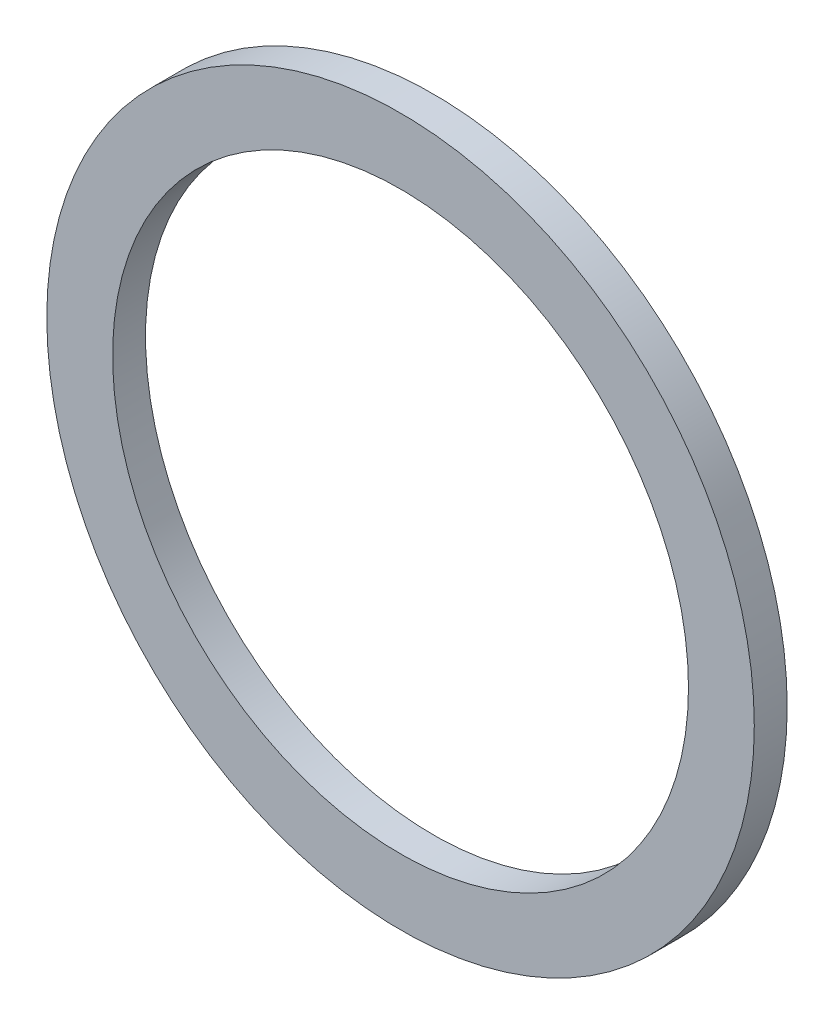
ISO-10303-21;
HEADER;
FILE_DESCRIPTION(('STEP AP214'),'2;1');
FILE_NAME('part.step','',(''),(''),'','','');
FILE_SCHEMA(('AUTOMOTIVE_DESIGN { 1 0 10303 214 1 1 1 1 }'));
ENDSEC;
DATA;
#1=APPLICATION_CONTEXT('core data for automotive mechanical design processes');
#2=APPLICATION_PROTOCOL_DEFINITION('international standard','automotive_design',2000,#1);
#3=PRODUCT_CONTEXT('',#1,'mechanical');
#4=PRODUCT('Part','Part','',(#3));
#5=PRODUCT_RELATED_PRODUCT_CATEGORY('part','',(#4));
#6=PRODUCT_DEFINITION_FORMATION('','',#4);
#7=PRODUCT_DEFINITION_CONTEXT('part definition',#1,'design');
#8=PRODUCT_DEFINITION('design','',#6,#7);
#9=PRODUCT_DEFINITION_SHAPE('','',#8);
#10=(LENGTH_UNIT() NAMED_UNIT(*) SI_UNIT(.MILLI.,.METRE.));
#11=(NAMED_UNIT(*) PLANE_ANGLE_UNIT() SI_UNIT($,.RADIAN.));
#12=(NAMED_UNIT(*) SI_UNIT($,.STERADIAN.) SOLID_ANGLE_UNIT());
#13=UNCERTAINTY_MEASURE_WITH_UNIT(LENGTH_MEASURE(1.E-05),#10,'distance_accuracy_value','');
#14=(GEOMETRIC_REPRESENTATION_CONTEXT(3) GLOBAL_UNCERTAINTY_ASSIGNED_CONTEXT((#13)) GLOBAL_UNIT_ASSIGNED_CONTEXT((#10,
#11,#12)) REPRESENTATION_CONTEXT('',''));
#15=CARTESIAN_POINT('',(0.,0.,0.));
#16=DIRECTION('',(0.,0.,1.));
#17=DIRECTION('',(1.,0.,0.));
#18=AXIS2_PLACEMENT_3D('',#15,#16,#17);
#19=CARTESIAN_POINT('',(0.,0.,-2.));
#20=DIRECTION('',(0.,0.,1.));
#21=DIRECTION('',(1.,0.,0.));
#22=AXIS2_PLACEMENT_3D('',#19,#20,#21);
#23=PLANE('',#22);
#24=CARTESIAN_POINT('',(0.,0.,-2.));
#25=DIRECTION('',(0.,0.,1.));
#26=DIRECTION('',(1.,0.,0.));
#27=AXIS2_PLACEMENT_3D('',#24,#25,#26);
#28=CIRCLE('',#27,17.5);
#29=CARTESIAN_POINT('',(17.5,0.,-2.));
#30=VERTEX_POINT('',#29);
#31=EDGE_CURVE('E27',#30,#30,#28,.T.);
#32=ORIENTED_EDGE('',*,*,#31,.T.);
#33=EDGE_LOOP('',(#32));
#34=FACE_BOUND('',#33,.T.);
#35=CARTESIAN_POINT('',(0.,0.,-2.));
#36=DIRECTION('',(0.,0.,1.));
#37=DIRECTION('',(1.,0.,0.));
#38=AXIS2_PLACEMENT_3D('',#35,#36,#37);
#39=CIRCLE('',#38,21.5);
#40=CARTESIAN_POINT('',(21.5,0.,-2.));
#41=VERTEX_POINT('',#40);
#42=EDGE_CURVE('E18',#41,#41,#39,.T.);
#43=ORIENTED_EDGE('',*,*,#42,.F.);
#44=EDGE_LOOP('',(#43));
#45=FACE_BOUND('',#44,.T.);
#46=ADVANCED_FACE('F15',(#34,#45),#23,.F.);
#47=CARTESIAN_POINT('',(0.,0.,0.));
#48=DIRECTION('',(0.,0.,1.));
#49=DIRECTION('',(1.,0.,0.));
#50=AXIS2_PLACEMENT_3D('',#47,#48,#49);
#51=CYLINDRICAL_SURFACE('',#50,21.5);
#52=CARTESIAN_POINT('',(0.,0.,0.));
#53=DIRECTION('',(0.,0.,1.));
#54=DIRECTION('',(1.,0.,0.));
#55=AXIS2_PLACEMENT_3D('',#52,#53,#54);
#56=CIRCLE('',#55,21.5);
#57=CARTESIAN_POINT('',(21.5,0.,0.));
#58=VERTEX_POINT('',#57);
#59=EDGE_CURVE('E22',#58,#58,#56,.T.);
#60=ORIENTED_EDGE('',*,*,#59,.F.);
#61=EDGE_LOOP('',(#60));
#62=FACE_BOUND('',#61,.T.);
#63=ORIENTED_EDGE('',*,*,#42,.T.);
#64=EDGE_LOOP('',(#63));
#65=FACE_BOUND('',#64,.T.);
#66=ADVANCED_FACE('F35',(#62,#65),#51,.T.);
#67=CARTESIAN_POINT('',(0.,0.,0.));
#68=DIRECTION('',(0.,0.,1.));
#69=DIRECTION('',(1.,0.,0.));
#70=AXIS2_PLACEMENT_3D('',#67,#68,#69);
#71=CYLINDRICAL_SURFACE('',#70,17.5);
#72=CARTESIAN_POINT('',(0.,0.,0.));
#73=DIRECTION('',(0.,0.,1.));
#74=DIRECTION('',(1.,0.,0.));
#75=AXIS2_PLACEMENT_3D('',#72,#73,#74);
#76=CIRCLE('',#75,17.5);
#77=CARTESIAN_POINT('',(17.5,0.,0.));
#78=VERTEX_POINT('',#77);
#79=EDGE_CURVE('E10',#78,#78,#76,.F.);
#80=ORIENTED_EDGE('',*,*,#79,.F.);
#81=EDGE_LOOP('',(#80));
#82=FACE_BOUND('',#81,.T.);
#83=ORIENTED_EDGE('',*,*,#31,.F.);
#84=EDGE_LOOP('',(#83));
#85=FACE_BOUND('',#84,.T.);
#86=ADVANCED_FACE('F42',(#82,#85),#71,.F.);
#87=CARTESIAN_POINT('',(0.,0.,0.));
#88=DIRECTION('',(0.,0.,1.));
#89=DIRECTION('',(1.,0.,0.));
#90=AXIS2_PLACEMENT_3D('',#87,#88,#89);
#91=PLANE('',#90);
#92=ORIENTED_EDGE('',*,*,#79,.T.);
#93=EDGE_LOOP('',(#92));
#94=FACE_BOUND('',#93,.T.);
#95=ORIENTED_EDGE('',*,*,#59,.T.);
#96=EDGE_LOOP('',(#95));
#97=FACE_BOUND('',#96,.T.);
#98=ADVANCED_FACE('F44',(#94,#97),#91,.T.);
#99=CLOSED_SHELL('',(#46,#66,#86,#98));
#100=MANIFOLD_SOLID_BREP('B1',#99);
#101=ADVANCED_BREP_SHAPE_REPRESENTATION('',(#18,#100),#14);
#102=SHAPE_DEFINITION_REPRESENTATION(#9,#101);
ENDSEC;
END-ISO-10303-21;
